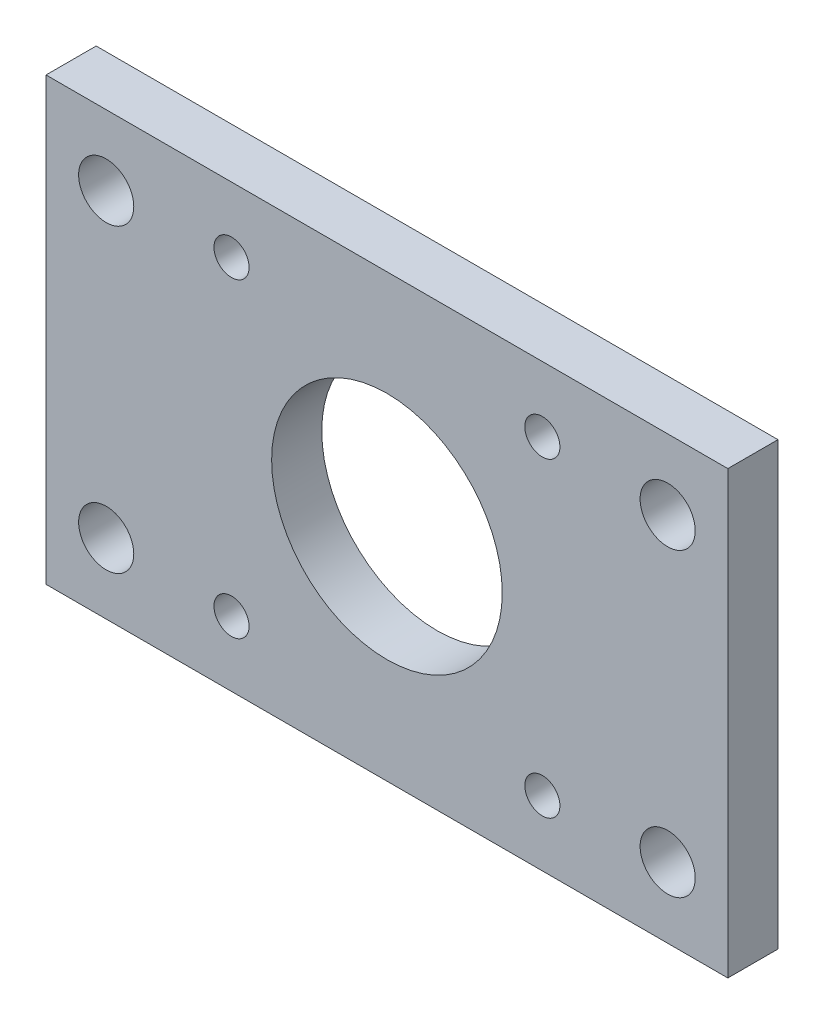
ISO-10303-21;
HEADER;
FILE_DESCRIPTION(('STEP AP214'),'2;1');
FILE_NAME('part.step','',(''),(''),'','','');
FILE_SCHEMA(('AUTOMOTIVE_DESIGN { 1 0 10303 214 1 1 1 1 }'));
ENDSEC;
DATA;
#1=APPLICATION_CONTEXT('core data for automotive mechanical design processes');
#2=APPLICATION_PROTOCOL_DEFINITION('international standard','automotive_design',2000,#1);
#3=PRODUCT_CONTEXT('',#1,'mechanical');
#4=PRODUCT('Part','Part','',(#3));
#5=PRODUCT_RELATED_PRODUCT_CATEGORY('part','',(#4));
#6=PRODUCT_DEFINITION_FORMATION('','',#4);
#7=PRODUCT_DEFINITION_CONTEXT('part definition',#1,'design');
#8=PRODUCT_DEFINITION('design','',#6,#7);
#9=PRODUCT_DEFINITION_SHAPE('','',#8);
#10=(LENGTH_UNIT() NAMED_UNIT(*) SI_UNIT(.MILLI.,.METRE.));
#11=(NAMED_UNIT(*) PLANE_ANGLE_UNIT() SI_UNIT($,.RADIAN.));
#12=(NAMED_UNIT(*) SI_UNIT($,.STERADIAN.) SOLID_ANGLE_UNIT());
#13=UNCERTAINTY_MEASURE_WITH_UNIT(LENGTH_MEASURE(1.E-05),#10,'distance_accuracy_value','');
#14=(GEOMETRIC_REPRESENTATION_CONTEXT(3) GLOBAL_UNCERTAINTY_ASSIGNED_CONTEXT((#13)) GLOBAL_UNIT_ASSIGNED_CONTEXT((#10,
#11,#12)) REPRESENTATION_CONTEXT('',''));
#15=CARTESIAN_POINT('',(0.,0.,0.));
#16=DIRECTION('',(0.,0.,1.));
#17=DIRECTION('',(1.,0.,0.));
#18=AXIS2_PLACEMENT_3D('',#15,#16,#17);
#19=CARTESIAN_POINT('',(28.,15.,-1.));
#20=DIRECTION('',(0.,0.,1.));
#21=DIRECTION('',(1.,0.,0.));
#22=AXIS2_PLACEMENT_3D('',#19,#20,#21);
#23=CYLINDRICAL_SURFACE('',#22,2.75);
#24=CARTESIAN_POINT('',(28.,15.,5.));
#25=DIRECTION('',(0.,0.,1.));
#26=DIRECTION('',(1.,0.,0.));
#27=AXIS2_PLACEMENT_3D('',#24,#25,#26);
#28=CIRCLE('',#27,2.75);
#29=CARTESIAN_POINT('',(30.75,15.,5.));
#30=VERTEX_POINT('',#29);
#31=EDGE_CURVE('E75',#30,#30,#28,.T.);
#32=ORIENTED_EDGE('',*,*,#31,.T.);
#33=EDGE_LOOP('',(#32));
#34=FACE_BOUND('',#33,.T.);
#35=CARTESIAN_POINT('',(28.,15.,0.));
#36=DIRECTION('',(0.,0.,1.));
#37=DIRECTION('',(1.,0.,0.));
#38=AXIS2_PLACEMENT_3D('',#35,#36,#37);
#39=CIRCLE('',#38,2.75);
#40=CARTESIAN_POINT('',(30.75,15.,0.));
#41=VERTEX_POINT('',#40);
#42=EDGE_CURVE('E10',#41,#41,#39,.T.);
#43=ORIENTED_EDGE('',*,*,#42,.F.);
#44=EDGE_LOOP('',(#43));
#45=FACE_BOUND('',#44,.T.);
#46=ADVANCED_FACE('F16',(#34,#45),#23,.F.);
#47=CARTESIAN_POINT('',(15.5,15.5,-1.));
#48=DIRECTION('',(0.,0.,1.));
#49=DIRECTION('',(1.,0.,0.));
#50=AXIS2_PLACEMENT_3D('',#47,#48,#49);
#51=CYLINDRICAL_SURFACE('',#50,1.75);
#52=CARTESIAN_POINT('',(15.5,15.5,5.));
#53=DIRECTION('',(0.,0.,1.));
#54=DIRECTION('',(1.,0.,0.));
#55=AXIS2_PLACEMENT_3D('',#52,#53,#54);
#56=CIRCLE('',#55,1.75);
#57=CARTESIAN_POINT('',(17.25,15.5,5.));
#58=VERTEX_POINT('',#57);
#59=EDGE_CURVE('E149',#58,#58,#56,.T.);
#60=ORIENTED_EDGE('',*,*,#59,.T.);
#61=EDGE_LOOP('',(#60));
#62=FACE_BOUND('',#61,.T.);
#63=CARTESIAN_POINT('',(15.5,15.5,0.));
#64=DIRECTION('',(0.,0.,1.));
#65=DIRECTION('',(1.,0.,0.));
#66=AXIS2_PLACEMENT_3D('',#63,#64,#65);
#67=CIRCLE('',#66,1.75);
#68=CARTESIAN_POINT('',(17.25,15.5,0.));
#69=VERTEX_POINT('',#68);
#70=EDGE_CURVE('E26',#69,#69,#67,.T.);
#71=ORIENTED_EDGE('',*,*,#70,.F.);
#72=EDGE_LOOP('',(#71));
#73=FACE_BOUND('',#72,.T.);
#74=ADVANCED_FACE('F18',(#62,#73),#51,.F.);
#75=CARTESIAN_POINT('',(0.,0.,-1.));
#76=DIRECTION('',(0.,0.,1.));
#77=DIRECTION('',(1.,0.,0.));
#78=AXIS2_PLACEMENT_3D('',#75,#76,#77);
#79=CYLINDRICAL_SURFACE('',#78,11.5);
#80=CARTESIAN_POINT('',(0.,0.,5.));
#81=DIRECTION('',(0.,0.,1.));
#82=DIRECTION('',(1.,0.,0.));
#83=AXIS2_PLACEMENT_3D('',#80,#81,#82);
#84=CIRCLE('',#83,11.5);
#85=CARTESIAN_POINT('',(11.5,0.,5.));
#86=VERTEX_POINT('',#85);
#87=EDGE_CURVE('E104',#86,#86,#84,.T.);
#88=ORIENTED_EDGE('',*,*,#87,.T.);
#89=EDGE_LOOP('',(#88));
#90=FACE_BOUND('',#89,.T.);
#91=CARTESIAN_POINT('',(0.,0.,0.));
#92=DIRECTION('',(0.,0.,1.));
#93=DIRECTION('',(1.,0.,0.));
#94=AXIS2_PLACEMENT_3D('',#91,#92,#93);
#95=CIRCLE('',#94,11.5);
#96=CARTESIAN_POINT('',(11.5,0.,0.));
#97=VERTEX_POINT('',#96);
#98=EDGE_CURVE('E138',#97,#97,#95,.T.);
#99=ORIENTED_EDGE('',*,*,#98,.F.);
#100=EDGE_LOOP('',(#99));
#101=FACE_BOUND('',#100,.T.);
#102=ADVANCED_FACE('F184',(#90,#101),#79,.F.);
#103=CARTESIAN_POINT('',(-15.5,15.5,-1.));
#104=DIRECTION('',(0.,0.,1.));
#105=DIRECTION('',(1.,0.,0.));
#106=AXIS2_PLACEMENT_3D('',#103,#104,#105);
#107=CYLINDRICAL_SURFACE('',#106,1.75);
#108=CARTESIAN_POINT('',(-15.5,15.5,5.));
#109=DIRECTION('',(0.,0.,1.));
#110=DIRECTION('',(1.,0.,0.));
#111=AXIS2_PLACEMENT_3D('',#108,#109,#110);
#112=CIRCLE('',#111,1.75);
#113=CARTESIAN_POINT('',(-13.75,15.5,5.));
#114=VERTEX_POINT('',#113);
#115=EDGE_CURVE('E102',#114,#114,#112,.T.);
#116=ORIENTED_EDGE('',*,*,#115,.T.);
#117=EDGE_LOOP('',(#116));
#118=FACE_BOUND('',#117,.T.);
#119=CARTESIAN_POINT('',(-15.5,15.5,0.));
#120=DIRECTION('',(0.,0.,1.));
#121=DIRECTION('',(1.,0.,0.));
#122=AXIS2_PLACEMENT_3D('',#119,#120,#121);
#123=CIRCLE('',#122,1.75);
#124=CARTESIAN_POINT('',(-13.75,15.5,0.));
#125=VERTEX_POINT('',#124);
#126=EDGE_CURVE('E174',#125,#125,#123,.T.);
#127=ORIENTED_EDGE('',*,*,#126,.F.);
#128=EDGE_LOOP('',(#127));
#129=FACE_BOUND('',#128,.T.);
#130=ADVANCED_FACE('F186',(#118,#129),#107,.F.);
#131=CARTESIAN_POINT('',(-28.,15.,-1.));
#132=DIRECTION('',(0.,0.,1.));
#133=DIRECTION('',(1.,0.,0.));
#134=AXIS2_PLACEMENT_3D('',#131,#132,#133);
#135=CYLINDRICAL_SURFACE('',#134,2.75);
#136=CARTESIAN_POINT('',(-28.,15.,5.));
#137=DIRECTION('',(0.,0.,1.));
#138=DIRECTION('',(1.,0.,0.));
#139=AXIS2_PLACEMENT_3D('',#136,#137,#138);
#140=CIRCLE('',#139,2.75);
#141=CARTESIAN_POINT('',(-25.25,15.,5.));
#142=VERTEX_POINT('',#141);
#143=EDGE_CURVE('E105',#142,#142,#140,.T.);
#144=ORIENTED_EDGE('',*,*,#143,.T.);
#145=EDGE_LOOP('',(#144));
#146=FACE_BOUND('',#145,.T.);
#147=CARTESIAN_POINT('',(-28.,15.,0.));
#148=DIRECTION('',(0.,0.,1.));
#149=DIRECTION('',(1.,0.,0.));
#150=AXIS2_PLACEMENT_3D('',#147,#148,#149);
#151=CIRCLE('',#150,2.75);
#152=CARTESIAN_POINT('',(-25.25,15.,0.));
#153=VERTEX_POINT('',#152);
#154=EDGE_CURVE('E121',#153,#153,#151,.T.);
#155=ORIENTED_EDGE('',*,*,#154,.F.);
#156=EDGE_LOOP('',(#155));
#157=FACE_BOUND('',#156,.T.);
#158=ADVANCED_FACE('F193',(#146,#157),#135,.F.);
#159=CARTESIAN_POINT('',(28.,-15.,-1.));
#160=DIRECTION('',(0.,0.,1.));
#161=DIRECTION('',(1.,0.,0.));
#162=AXIS2_PLACEMENT_3D('',#159,#160,#161);
#163=CYLINDRICAL_SURFACE('',#162,2.75);
#164=CARTESIAN_POINT('',(28.,-15.,5.));
#165=DIRECTION('',(0.,0.,1.));
#166=DIRECTION('',(1.,0.,0.));
#167=AXIS2_PLACEMENT_3D('',#164,#165,#166);
#168=CIRCLE('',#167,2.75);
#169=CARTESIAN_POINT('',(30.75,-15.,5.));
#170=VERTEX_POINT('',#169);
#171=EDGE_CURVE('E126',#170,#170,#168,.T.);
#172=ORIENTED_EDGE('',*,*,#171,.T.);
#173=EDGE_LOOP('',(#172));
#174=FACE_BOUND('',#173,.T.);
#175=CARTESIAN_POINT('',(28.,-15.,0.));
#176=DIRECTION('',(0.,0.,1.));
#177=DIRECTION('',(1.,0.,0.));
#178=AXIS2_PLACEMENT_3D('',#175,#176,#177);
#179=CIRCLE('',#178,2.75);
#180=CARTESIAN_POINT('',(30.75,-15.,0.));
#181=VERTEX_POINT('',#180);
#182=EDGE_CURVE('E117',#181,#181,#179,.T.);
#183=ORIENTED_EDGE('',*,*,#182,.F.);
#184=EDGE_LOOP('',(#183));
#185=FACE_BOUND('',#184,.T.);
#186=ADVANCED_FACE('F230',(#174,#185),#163,.F.);
#187=CARTESIAN_POINT('',(15.5,-15.5,-1.));
#188=DIRECTION('',(0.,0.,1.));
#189=DIRECTION('',(1.,0.,0.));
#190=AXIS2_PLACEMENT_3D('',#187,#188,#189);
#191=CYLINDRICAL_SURFACE('',#190,1.75);
#192=CARTESIAN_POINT('',(15.5,-15.5,5.));
#193=DIRECTION('',(0.,0.,1.));
#194=DIRECTION('',(1.,0.,0.));
#195=AXIS2_PLACEMENT_3D('',#192,#193,#194);
#196=CIRCLE('',#195,1.75);
#197=CARTESIAN_POINT('',(17.25,-15.5,5.));
#198=VERTEX_POINT('',#197);
#199=EDGE_CURVE('E142',#198,#198,#196,.T.);
#200=ORIENTED_EDGE('',*,*,#199,.T.);
#201=EDGE_LOOP('',(#200));
#202=FACE_BOUND('',#201,.T.);
#203=CARTESIAN_POINT('',(15.5,-15.5,0.));
#204=DIRECTION('',(0.,0.,1.));
#205=DIRECTION('',(1.,0.,0.));
#206=AXIS2_PLACEMENT_3D('',#203,#204,#205);
#207=CIRCLE('',#206,1.75);
#208=CARTESIAN_POINT('',(17.25,-15.5,0.));
#209=VERTEX_POINT('',#208);
#210=EDGE_CURVE('E122',#209,#209,#207,.T.);
#211=ORIENTED_EDGE('',*,*,#210,.F.);
#212=EDGE_LOOP('',(#211));
#213=FACE_BOUND('',#212,.T.);
#214=ADVANCED_FACE('F210',(#202,#213),#191,.F.);
#215=CARTESIAN_POINT('',(-15.5,-15.5,-1.));
#216=DIRECTION('',(0.,0.,1.));
#217=DIRECTION('',(1.,0.,0.));
#218=AXIS2_PLACEMENT_3D('',#215,#216,#217);
#219=CYLINDRICAL_SURFACE('',#218,1.75);
#220=CARTESIAN_POINT('',(-15.5,-15.5,5.));
#221=DIRECTION('',(0.,0.,1.));
#222=DIRECTION('',(1.,0.,0.));
#223=AXIS2_PLACEMENT_3D('',#220,#221,#222);
#224=CIRCLE('',#223,1.75);
#225=CARTESIAN_POINT('',(-13.75,-15.5,5.));
#226=VERTEX_POINT('',#225);
#227=EDGE_CURVE('E133',#226,#226,#224,.T.);
#228=ORIENTED_EDGE('',*,*,#227,.T.);
#229=EDGE_LOOP('',(#228));
#230=FACE_BOUND('',#229,.T.);
#231=CARTESIAN_POINT('',(-15.5,-15.5,0.));
#232=DIRECTION('',(0.,0.,1.));
#233=DIRECTION('',(1.,0.,0.));
#234=AXIS2_PLACEMENT_3D('',#231,#232,#233);
#235=CIRCLE('',#234,1.75);
#236=CARTESIAN_POINT('',(-13.75,-15.5,0.));
#237=VERTEX_POINT('',#236);
#238=EDGE_CURVE('E164',#237,#237,#235,.T.);
#239=ORIENTED_EDGE('',*,*,#238,.F.);
#240=EDGE_LOOP('',(#239));
#241=FACE_BOUND('',#240,.T.);
#242=ADVANCED_FACE('F206',(#230,#241),#219,.F.);
#243=CARTESIAN_POINT('',(-28.,-15.,-1.));
#244=DIRECTION('',(0.,0.,1.));
#245=DIRECTION('',(1.,0.,0.));
#246=AXIS2_PLACEMENT_3D('',#243,#244,#245);
#247=CYLINDRICAL_SURFACE('',#246,2.75);
#248=CARTESIAN_POINT('',(-28.,-15.,5.));
#249=DIRECTION('',(0.,0.,1.));
#250=DIRECTION('',(1.,0.,0.));
#251=AXIS2_PLACEMENT_3D('',#248,#249,#250);
#252=CIRCLE('',#251,2.75);
#253=CARTESIAN_POINT('',(-25.25,-15.,5.));
#254=VERTEX_POINT('',#253);
#255=EDGE_CURVE('E129',#254,#254,#252,.T.);
#256=ORIENTED_EDGE('',*,*,#255,.T.);
#257=EDGE_LOOP('',(#256));
#258=FACE_BOUND('',#257,.T.);
#259=CARTESIAN_POINT('',(-28.,-15.,0.));
#260=DIRECTION('',(0.,0.,1.));
#261=DIRECTION('',(1.,0.,0.));
#262=AXIS2_PLACEMENT_3D('',#259,#260,#261);
#263=CIRCLE('',#262,2.75);
#264=CARTESIAN_POINT('',(-25.25,-15.,0.));
#265=VERTEX_POINT('',#264);
#266=EDGE_CURVE('E160',#265,#265,#263,.T.);
#267=ORIENTED_EDGE('',*,*,#266,.F.);
#268=EDGE_LOOP('',(#267));
#269=FACE_BOUND('',#268,.T.);
#270=ADVANCED_FACE('F209',(#258,#269),#247,.F.);
#271=CARTESIAN_POINT('',(34.,-22.,0.));
#272=DIRECTION('',(1.,0.,0.));
#273=DIRECTION('',(0.,1.,0.));
#274=AXIS2_PLACEMENT_3D('',#271,#272,#273);
#275=PLANE('',#274);
#276=DIRECTION('',(0.,0.,1.));
#277=VECTOR('',#276,1.);
#278=CARTESIAN_POINT('',(34.,-22.,0.));
#279=LINE('',#278,#277);
#280=CARTESIAN_POINT('',(34.,-22.,0.));
#281=VERTEX_POINT('',#280);
#282=CARTESIAN_POINT('',(34.,-22.,5.));
#283=VERTEX_POINT('',#282);
#284=EDGE_CURVE('E107',#281,#283,#279,.T.);
#285=ORIENTED_EDGE('',*,*,#284,.F.);
#286=DIRECTION('',(0.,1.,0.));
#287=VECTOR('',#286,1.);
#288=CARTESIAN_POINT('',(34.,-22.,0.));
#289=LINE('',#288,#287);
#290=CARTESIAN_POINT('',(34.,22.,0.));
#291=VERTEX_POINT('',#290);
#292=EDGE_CURVE('E38',#281,#291,#289,.T.);
#293=ORIENTED_EDGE('',*,*,#292,.T.);
#294=DIRECTION('',(0.,0.,1.));
#295=VECTOR('',#294,1.);
#296=CARTESIAN_POINT('',(34.,22.,0.));
#297=LINE('',#296,#295);
#298=CARTESIAN_POINT('',(34.,22.,5.));
#299=VERTEX_POINT('',#298);
#300=EDGE_CURVE('E72',#291,#299,#297,.T.);
#301=ORIENTED_EDGE('',*,*,#300,.T.);
#302=DIRECTION('',(0.,1.,0.));
#303=VECTOR('',#302,1.);
#304=CARTESIAN_POINT('',(34.,-22.,5.));
#305=LINE('',#304,#303);
#306=EDGE_CURVE('E100',#283,#299,#305,.T.);
#307=ORIENTED_EDGE('',*,*,#306,.F.);
#308=EDGE_LOOP('',(#285,#293,#301,#307));
#309=FACE_BOUND('',#308,.T.);
#310=ADVANCED_FACE('F214',(#309),#275,.T.);
#311=CARTESIAN_POINT('',(-34.,-22.,0.));
#312=DIRECTION('',(0.,0.,1.));
#313=DIRECTION('',(1.,0.,0.));
#314=AXIS2_PLACEMENT_3D('',#311,#312,#313);
#315=PLANE('',#314);
#316=ORIENTED_EDGE('',*,*,#42,.T.);
#317=EDGE_LOOP('',(#316));
#318=FACE_BOUND('',#317,.T.);
#319=ORIENTED_EDGE('',*,*,#70,.T.);
#320=EDGE_LOOP('',(#319));
#321=FACE_BOUND('',#320,.T.);
#322=ORIENTED_EDGE('',*,*,#98,.T.);
#323=EDGE_LOOP('',(#322));
#324=FACE_BOUND('',#323,.T.);
#325=ORIENTED_EDGE('',*,*,#126,.T.);
#326=EDGE_LOOP('',(#325));
#327=FACE_BOUND('',#326,.T.);
#328=ORIENTED_EDGE('',*,*,#154,.T.);
#329=EDGE_LOOP('',(#328));
#330=FACE_BOUND('',#329,.T.);
#331=ORIENTED_EDGE('',*,*,#182,.T.);
#332=EDGE_LOOP('',(#331));
#333=FACE_BOUND('',#332,.T.);
#334=ORIENTED_EDGE('',*,*,#210,.T.);
#335=EDGE_LOOP('',(#334));
#336=FACE_BOUND('',#335,.T.);
#337=ORIENTED_EDGE('',*,*,#238,.T.);
#338=EDGE_LOOP('',(#337));
#339=FACE_BOUND('',#338,.T.);
#340=ORIENTED_EDGE('',*,*,#266,.T.);
#341=EDGE_LOOP('',(#340));
#342=FACE_BOUND('',#341,.T.);
#343=DIRECTION('',(1.,0.,0.));
#344=VECTOR('',#343,1.);
#345=CARTESIAN_POINT('',(-34.,22.,0.));
#346=LINE('',#345,#344);
#347=CARTESIAN_POINT('',(-34.,22.,0.));
#348=VERTEX_POINT('',#347);
#349=EDGE_CURVE('E65',#348,#291,#346,.T.);
#350=ORIENTED_EDGE('',*,*,#349,.T.);
#351=ORIENTED_EDGE('',*,*,#292,.F.);
#352=DIRECTION('',(1.,0.,0.));
#353=VECTOR('',#352,1.);
#354=CARTESIAN_POINT('',(-34.,-22.,0.));
#355=LINE('',#354,#353);
#356=CARTESIAN_POINT('',(-34.,-22.,0.));
#357=VERTEX_POINT('',#356);
#358=EDGE_CURVE('E81',#357,#281,#355,.T.);
#359=ORIENTED_EDGE('',*,*,#358,.F.);
#360=DIRECTION('',(0.,1.,0.));
#361=VECTOR('',#360,1.);
#362=CARTESIAN_POINT('',(-34.,-22.,0.));
#363=LINE('',#362,#361);
#364=EDGE_CURVE('E78',#357,#348,#363,.T.);
#365=ORIENTED_EDGE('',*,*,#364,.T.);
#366=EDGE_LOOP('',(#350,#351,#359,#365));
#367=FACE_BOUND('',#366,.T.);
#368=ADVANCED_FACE('F79',(#318,#321,#324,#327,#330,#333,#336,#339,#342,#367),#315,.F.);
#369=CARTESIAN_POINT('',(-34.,22.,0.));
#370=DIRECTION('',(0.,1.,0.));
#371=DIRECTION('',(1.,0.,0.));
#372=AXIS2_PLACEMENT_3D('',#369,#370,#371);
#373=PLANE('',#372);
#374=ORIENTED_EDGE('',*,*,#349,.F.);
#375=DIRECTION('',(0.,0.,1.));
#376=VECTOR('',#375,1.);
#377=CARTESIAN_POINT('',(-34.,22.,0.));
#378=LINE('',#377,#376);
#379=CARTESIAN_POINT('',(-34.,22.,5.));
#380=VERTEX_POINT('',#379);
#381=EDGE_CURVE('E70',#348,#380,#378,.T.);
#382=ORIENTED_EDGE('',*,*,#381,.T.);
#383=DIRECTION('',(1.,0.,0.));
#384=VECTOR('',#383,1.);
#385=CARTESIAN_POINT('',(-34.,22.,5.));
#386=LINE('',#385,#384);
#387=EDGE_CURVE('E134',#380,#299,#386,.T.);
#388=ORIENTED_EDGE('',*,*,#387,.T.);
#389=ORIENTED_EDGE('',*,*,#300,.F.);
#390=EDGE_LOOP('',(#374,#382,#388,#389));
#391=FACE_BOUND('',#390,.T.);
#392=ADVANCED_FACE('F67',(#391),#373,.T.);
#393=CARTESIAN_POINT('',(-34.,-22.,5.));
#394=DIRECTION('',(0.,0.,1.));
#395=DIRECTION('',(1.,0.,0.));
#396=AXIS2_PLACEMENT_3D('',#393,#394,#395);
#397=PLANE('',#396);
#398=ORIENTED_EDGE('',*,*,#31,.F.);
#399=EDGE_LOOP('',(#398));
#400=FACE_BOUND('',#399,.T.);
#401=ORIENTED_EDGE('',*,*,#59,.F.);
#402=EDGE_LOOP('',(#401));
#403=FACE_BOUND('',#402,.T.);
#404=ORIENTED_EDGE('',*,*,#87,.F.);
#405=EDGE_LOOP('',(#404));
#406=FACE_BOUND('',#405,.T.);
#407=ORIENTED_EDGE('',*,*,#115,.F.);
#408=EDGE_LOOP('',(#407));
#409=FACE_BOUND('',#408,.T.);
#410=ORIENTED_EDGE('',*,*,#143,.F.);
#411=EDGE_LOOP('',(#410));
#412=FACE_BOUND('',#411,.T.);
#413=ORIENTED_EDGE('',*,*,#171,.F.);
#414=EDGE_LOOP('',(#413));
#415=FACE_BOUND('',#414,.T.);
#416=ORIENTED_EDGE('',*,*,#199,.F.);
#417=EDGE_LOOP('',(#416));
#418=FACE_BOUND('',#417,.T.);
#419=ORIENTED_EDGE('',*,*,#227,.F.);
#420=EDGE_LOOP('',(#419));
#421=FACE_BOUND('',#420,.T.);
#422=ORIENTED_EDGE('',*,*,#255,.F.);
#423=EDGE_LOOP('',(#422));
#424=FACE_BOUND('',#423,.T.);
#425=DIRECTION('',(0.,1.,0.));
#426=VECTOR('',#425,1.);
#427=CARTESIAN_POINT('',(-34.,-22.,5.));
#428=LINE('',#427,#426);
#429=CARTESIAN_POINT('',(-34.,-22.,5.));
#430=VERTEX_POINT('',#429);
#431=EDGE_CURVE('E90',#430,#380,#428,.T.);
#432=ORIENTED_EDGE('',*,*,#431,.F.);
#433=DIRECTION('',(1.,0.,0.));
#434=VECTOR('',#433,1.);
#435=CARTESIAN_POINT('',(-34.,-22.,5.));
#436=LINE('',#435,#434);
#437=EDGE_CURVE('E111',#430,#283,#436,.T.);
#438=ORIENTED_EDGE('',*,*,#437,.T.);
#439=ORIENTED_EDGE('',*,*,#306,.T.);
#440=ORIENTED_EDGE('',*,*,#387,.F.);
#441=EDGE_LOOP('',(#432,#438,#439,#440));
#442=FACE_BOUND('',#441,.T.);
#443=ADVANCED_FACE('F219',(#400,#403,#406,#409,#412,#415,#418,#421,#424,#442),#397,.T.);
#444=CARTESIAN_POINT('',(-34.,-22.,0.));
#445=DIRECTION('',(0.,1.,0.));
#446=DIRECTION('',(1.,0.,0.));
#447=AXIS2_PLACEMENT_3D('',#444,#445,#446);
#448=PLANE('',#447);
#449=ORIENTED_EDGE('',*,*,#284,.T.);
#450=ORIENTED_EDGE('',*,*,#437,.F.);
#451=DIRECTION('',(0.,0.,1.));
#452=VECTOR('',#451,1.);
#453=CARTESIAN_POINT('',(-34.,-22.,0.));
#454=LINE('',#453,#452);
#455=EDGE_CURVE('E86',#357,#430,#454,.T.);
#456=ORIENTED_EDGE('',*,*,#455,.F.);
#457=ORIENTED_EDGE('',*,*,#358,.T.);
#458=EDGE_LOOP('',(#449,#450,#456,#457));
#459=FACE_BOUND('',#458,.T.);
#460=ADVANCED_FACE('F216',(#459),#448,.F.);
#461=CARTESIAN_POINT('',(-34.,-22.,0.));
#462=DIRECTION('',(1.,0.,0.));
#463=DIRECTION('',(0.,1.,0.));
#464=AXIS2_PLACEMENT_3D('',#461,#462,#463);
#465=PLANE('',#464);
#466=ORIENTED_EDGE('',*,*,#431,.T.);
#467=ORIENTED_EDGE('',*,*,#381,.F.);
#468=ORIENTED_EDGE('',*,*,#364,.F.);
#469=ORIENTED_EDGE('',*,*,#455,.T.);
#470=EDGE_LOOP('',(#466,#467,#468,#469));
#471=FACE_BOUND('',#470,.T.);
#472=ADVANCED_FACE('F88',(#471),#465,.F.);
#473=CLOSED_SHELL('',(#46,#74,#102,#130,#158,#186,#214,#242,#270,#310,#368,#392,#443,#460,#472));
#474=MANIFOLD_SOLID_BREP('B1',#473);
#475=ADVANCED_BREP_SHAPE_REPRESENTATION('',(#18,#474),#14);
#476=SHAPE_DEFINITION_REPRESENTATION(#9,#475);
ENDSEC;
END-ISO-10303-21;
